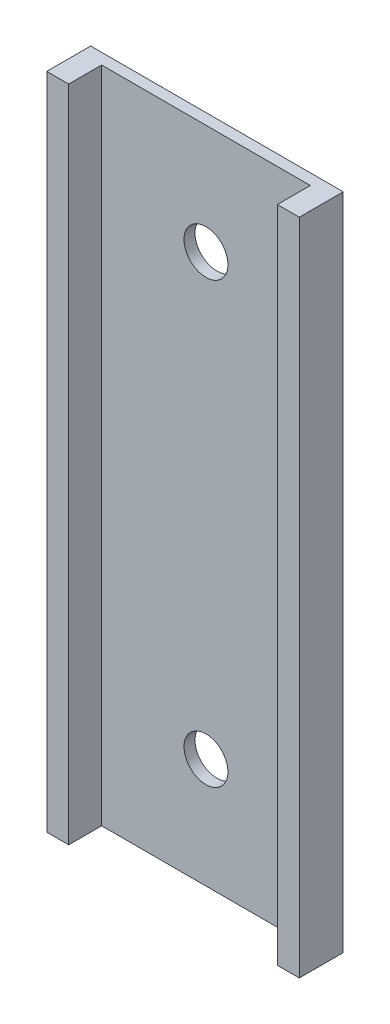
ISO-10303-21;
HEADER;
FILE_DESCRIPTION(('STEP AP214'),'2;1');
FILE_NAME('part.step','',(''),(''),'','','');
FILE_SCHEMA(('AUTOMOTIVE_DESIGN { 1 0 10303 214 1 1 1 1 }'));
ENDSEC;
DATA;
#1=APPLICATION_CONTEXT('core data for automotive mechanical design processes');
#2=APPLICATION_PROTOCOL_DEFINITION('international standard','automotive_design',2000,#1);
#3=PRODUCT_CONTEXT('',#1,'mechanical');
#4=PRODUCT('Part','Part','',(#3));
#5=PRODUCT_RELATED_PRODUCT_CATEGORY('part','',(#4));
#6=PRODUCT_DEFINITION_FORMATION('','',#4);
#7=PRODUCT_DEFINITION_CONTEXT('part definition',#1,'design');
#8=PRODUCT_DEFINITION('design','',#6,#7);
#9=PRODUCT_DEFINITION_SHAPE('','',#8);
#10=(LENGTH_UNIT() NAMED_UNIT(*) SI_UNIT(.MILLI.,.METRE.));
#11=(NAMED_UNIT(*) PLANE_ANGLE_UNIT() SI_UNIT($,.RADIAN.));
#12=(NAMED_UNIT(*) SI_UNIT($,.STERADIAN.) SOLID_ANGLE_UNIT());
#13=UNCERTAINTY_MEASURE_WITH_UNIT(LENGTH_MEASURE(1.E-05),#10,'distance_accuracy_value','');
#14=(GEOMETRIC_REPRESENTATION_CONTEXT(3) GLOBAL_UNCERTAINTY_ASSIGNED_CONTEXT((#13)) GLOBAL_UNIT_ASSIGNED_CONTEXT((#10,
#11,#12)) REPRESENTATION_CONTEXT('',''));
#15=CARTESIAN_POINT('',(0.,0.,0.));
#16=DIRECTION('',(0.,0.,1.));
#17=DIRECTION('',(1.,0.,0.));
#18=AXIS2_PLACEMENT_3D('',#15,#16,#17);
#19=CARTESIAN_POINT('',(0.,0.,4.));
#20=DIRECTION('',(0.,0.,-1.));
#21=DIRECTION('',(-1.,0.,0.));
#22=AXIS2_PLACEMENT_3D('',#19,#20,#21);
#23=PLANE('',#22);
#24=DIRECTION('',(-1.,0.,0.));
#25=VECTOR('',#24,1.);
#26=CARTESIAN_POINT('',(0.051140333410662,-40.0299787172891,4.));
#27=LINE('',#26,#25);
#28=CARTESIAN_POINT('',(23.0511403334107,-40.0299787172891,4.));
#29=VERTEX_POINT('',#28);
#30=CARTESIAN_POINT('',(21.0511403334107,-40.0299787172891,4.));
#31=VERTEX_POINT('',#30);
#32=EDGE_CURVE('E149',#29,#31,#27,.T.);
#33=ORIENTED_EDGE('',*,*,#32,.T.);
#34=DIRECTION('',(0.,-1.,0.));
#35=VECTOR('',#34,1.);
#36=CARTESIAN_POINT('',(21.0511403334107,0.,4.));
#37=LINE('',#36,#35);
#38=CARTESIAN_POINT('',(21.0511403334107,-100.029978717289,4.));
#39=VERTEX_POINT('',#38);
#40=EDGE_CURVE('E11',#31,#39,#37,.T.);
#41=ORIENTED_EDGE('',*,*,#40,.T.);
#42=DIRECTION('',(1.,0.,0.));
#43=VECTOR('',#42,1.);
#44=CARTESIAN_POINT('',(0.051140333410662,-100.029978717289,4.));
#45=LINE('',#44,#43);
#46=CARTESIAN_POINT('',(23.0511403334107,-100.029978717289,4.));
#47=VERTEX_POINT('',#46);
#48=EDGE_CURVE('E130',#39,#47,#45,.T.);
#49=ORIENTED_EDGE('',*,*,#48,.T.);
#50=DIRECTION('',(0.,1.,0.));
#51=VECTOR('',#50,1.);
#52=CARTESIAN_POINT('',(23.0511403334107,-100.029978717289,4.));
#53=LINE('',#52,#51);
#54=EDGE_CURVE('E147',#47,#29,#53,.T.);
#55=ORIENTED_EDGE('',*,*,#54,.T.);
#56=EDGE_LOOP('',(#33,#41,#49,#55));
#57=FACE_BOUND('',#56,.T.);
#58=ADVANCED_FACE('F32',(#57),#23,.F.);
#59=CARTESIAN_POINT('',(0.051140333410662,-100.029978717289,4.));
#60=DIRECTION('',(1.,0.,0.));
#61=DIRECTION('',(0.,0.,-1.));
#62=AXIS2_PLACEMENT_3D('',#59,#60,#61);
#63=PLANE('',#62);
#64=DIRECTION('',(0.,-1.,0.));
#65=VECTOR('',#64,1.);
#66=CARTESIAN_POINT('',(0.051140333410662,-100.029978717289,0.));
#67=LINE('',#66,#65);
#68=CARTESIAN_POINT('',(0.051140333410662,-40.0299787172891,0.));
#69=VERTEX_POINT('',#68);
#70=CARTESIAN_POINT('',(0.051140333410662,-100.029978717289,0.));
#71=VERTEX_POINT('',#70);
#72=EDGE_CURVE('E142',#69,#71,#67,.T.);
#73=ORIENTED_EDGE('',*,*,#72,.T.);
#74=DIRECTION('',(0.,0.,-1.));
#75=VECTOR('',#74,1.);
#76=CARTESIAN_POINT('',(0.051140333410662,-100.029978717289,4.));
#77=LINE('',#76,#75);
#78=CARTESIAN_POINT('',(0.051140333410662,-100.029978717289,4.));
#79=VERTEX_POINT('',#78);
#80=EDGE_CURVE('E166',#79,#71,#77,.T.);
#81=ORIENTED_EDGE('',*,*,#80,.F.);
#82=DIRECTION('',(0.,-1.,0.));
#83=VECTOR('',#82,1.);
#84=CARTESIAN_POINT('',(0.051140333410662,-100.029978717289,4.));
#85=LINE('',#84,#83);
#86=CARTESIAN_POINT('',(0.051140333410662,-40.0299787172891,4.));
#87=VERTEX_POINT('',#86);
#88=EDGE_CURVE('E144',#87,#79,#85,.T.);
#89=ORIENTED_EDGE('',*,*,#88,.F.);
#90=DIRECTION('',(0.,0.,-1.));
#91=VECTOR('',#90,1.);
#92=CARTESIAN_POINT('',(0.051140333410662,-40.0299787172891,4.));
#93=LINE('',#92,#91);
#94=EDGE_CURVE('E152',#87,#69,#93,.T.);
#95=ORIENTED_EDGE('',*,*,#94,.T.);
#96=EDGE_LOOP('',(#73,#81,#89,#95));
#97=FACE_BOUND('',#96,.T.);
#98=ADVANCED_FACE('F34',(#97),#63,.F.);
#99=CARTESIAN_POINT('',(0.051140333410662,-100.029978717289,4.));
#100=DIRECTION('',(0.,1.,0.));
#101=DIRECTION('',(-1.,0.,0.));
#102=AXIS2_PLACEMENT_3D('',#99,#100,#101);
#103=PLANE('',#102);
#104=ORIENTED_EDGE('',*,*,#48,.F.);
#105=DIRECTION('',(0.,0.,-1.));
#106=VECTOR('',#105,1.);
#107=CARTESIAN_POINT('',(21.0511403334107,-100.029978717289,1.));
#108=LINE('',#107,#106);
#109=CARTESIAN_POINT('',(21.0511403334107,-100.029978717289,1.));
#110=VERTEX_POINT('',#109);
#111=EDGE_CURVE('E113',#39,#110,#108,.T.);
#112=ORIENTED_EDGE('',*,*,#111,.T.);
#113=DIRECTION('',(-1.,0.,0.));
#114=VECTOR('',#113,1.);
#115=CARTESIAN_POINT('',(21.0511403334107,-100.029978717289,1.));
#116=LINE('',#115,#114);
#117=CARTESIAN_POINT('',(2.05114033341066,-100.029978717289,1.));
#118=VERTEX_POINT('',#117);
#119=EDGE_CURVE('E123',#110,#118,#116,.T.);
#120=ORIENTED_EDGE('',*,*,#119,.T.);
#121=DIRECTION('',(0.,0.,1.));
#122=VECTOR('',#121,1.);
#123=CARTESIAN_POINT('',(2.05114033341066,-100.029978717289,1.));
#124=LINE('',#123,#122);
#125=CARTESIAN_POINT('',(2.05114033341066,-100.029978717289,4.));
#126=VERTEX_POINT('',#125);
#127=EDGE_CURVE('E120',#118,#126,#124,.T.);
#128=ORIENTED_EDGE('',*,*,#127,.T.);
#129=EDGE_CURVE('E87',#79,#126,#45,.T.);
#130=ORIENTED_EDGE('',*,*,#129,.F.);
#131=ORIENTED_EDGE('',*,*,#80,.T.);
#132=DIRECTION('',(1.,0.,0.));
#133=VECTOR('',#132,1.);
#134=CARTESIAN_POINT('',(0.051140333410662,-100.029978717289,0.));
#135=LINE('',#134,#133);
#136=CARTESIAN_POINT('',(23.0511403334107,-100.029978717289,0.));
#137=VERTEX_POINT('',#136);
#138=EDGE_CURVE('E155',#71,#137,#135,.T.);
#139=ORIENTED_EDGE('',*,*,#138,.T.);
#140=DIRECTION('',(0.,0.,-1.));
#141=VECTOR('',#140,1.);
#142=CARTESIAN_POINT('',(23.0511403334107,-100.029978717289,4.));
#143=LINE('',#142,#141);
#144=EDGE_CURVE('E163',#47,#137,#143,.T.);
#145=ORIENTED_EDGE('',*,*,#144,.F.);
#146=EDGE_LOOP('',(#104,#112,#120,#128,#130,#131,#139,#145));
#147=FACE_BOUND('',#146,.T.);
#148=ADVANCED_FACE('F128',(#147),#103,.F.);
#149=CARTESIAN_POINT('',(23.0511403334107,-100.029978717289,4.));
#150=DIRECTION('',(-1.,0.,0.));
#151=DIRECTION('',(0.,0.,1.));
#152=AXIS2_PLACEMENT_3D('',#149,#150,#151);
#153=PLANE('',#152);
#154=DIRECTION('',(0.,1.,0.));
#155=VECTOR('',#154,1.);
#156=CARTESIAN_POINT('',(23.0511403334107,-100.029978717289,0.));
#157=LINE('',#156,#155);
#158=CARTESIAN_POINT('',(23.0511403334107,-40.0299787172891,0.));
#159=VERTEX_POINT('',#158);
#160=EDGE_CURVE('E157',#137,#159,#157,.T.);
#161=ORIENTED_EDGE('',*,*,#160,.T.);
#162=DIRECTION('',(0.,0.,-1.));
#163=VECTOR('',#162,1.);
#164=CARTESIAN_POINT('',(23.0511403334107,-40.0299787172891,4.));
#165=LINE('',#164,#163);
#166=EDGE_CURVE('E161',#29,#159,#165,.T.);
#167=ORIENTED_EDGE('',*,*,#166,.F.);
#168=ORIENTED_EDGE('',*,*,#54,.F.);
#169=ORIENTED_EDGE('',*,*,#144,.T.);
#170=EDGE_LOOP('',(#161,#167,#168,#169));
#171=FACE_BOUND('',#170,.T.);
#172=ADVANCED_FACE('F201',(#171),#153,.F.);
#173=CARTESIAN_POINT('',(0.051140333410662,-40.0299787172891,4.));
#174=DIRECTION('',(0.,-1.,0.));
#175=DIRECTION('',(0.,0.,-1.));
#176=AXIS2_PLACEMENT_3D('',#173,#174,#175);
#177=PLANE('',#176);
#178=DIRECTION('',(-1.,0.,0.));
#179=VECTOR('',#178,1.);
#180=CARTESIAN_POINT('',(21.0511403334107,-40.0299787172891,1.));
#181=LINE('',#180,#179);
#182=CARTESIAN_POINT('',(21.0511403334107,-40.0299787172891,1.));
#183=VERTEX_POINT('',#182);
#184=CARTESIAN_POINT('',(2.05114033341066,-40.0299787172891,1.));
#185=VERTEX_POINT('',#184);
#186=EDGE_CURVE('E132',#183,#185,#181,.T.);
#187=ORIENTED_EDGE('',*,*,#186,.F.);
#188=DIRECTION('',(0.,0.,-1.));
#189=VECTOR('',#188,1.);
#190=CARTESIAN_POINT('',(21.0511403334107,-40.0299787172891,1.));
#191=LINE('',#190,#189);
#192=EDGE_CURVE('E115',#31,#183,#191,.T.);
#193=ORIENTED_EDGE('',*,*,#192,.F.);
#194=ORIENTED_EDGE('',*,*,#32,.F.);
#195=ORIENTED_EDGE('',*,*,#166,.T.);
#196=DIRECTION('',(-1.,0.,0.));
#197=VECTOR('',#196,1.);
#198=CARTESIAN_POINT('',(0.051140333410662,-40.0299787172891,0.));
#199=LINE('',#198,#197);
#200=EDGE_CURVE('E79',#159,#69,#199,.T.);
#201=ORIENTED_EDGE('',*,*,#200,.T.);
#202=ORIENTED_EDGE('',*,*,#94,.F.);
#203=CARTESIAN_POINT('',(2.05114033341066,-40.0299787172891,4.));
#204=VERTEX_POINT('',#203);
#205=EDGE_CURVE('E57',#204,#87,#27,.T.);
#206=ORIENTED_EDGE('',*,*,#205,.F.);
#207=DIRECTION('',(0.,0.,1.));
#208=VECTOR('',#207,1.);
#209=CARTESIAN_POINT('',(2.05114033341066,-40.0299787172891,1.));
#210=LINE('',#209,#208);
#211=EDGE_CURVE('E49',#185,#204,#210,.T.);
#212=ORIENTED_EDGE('',*,*,#211,.F.);
#213=EDGE_LOOP('',(#187,#193,#194,#195,#201,#202,#206,#212));
#214=FACE_BOUND('',#213,.T.);
#215=ADVANCED_FACE('F195',(#214),#177,.F.);
#216=ORIENTED_EDGE('',*,*,#129,.T.);
#217=DIRECTION('',(0.,1.,0.));
#218=VECTOR('',#217,1.);
#219=CARTESIAN_POINT('',(2.05114033341066,0.,4.));
#220=LINE('',#219,#218);
#221=EDGE_CURVE('E41',#126,#204,#220,.T.);
#222=ORIENTED_EDGE('',*,*,#221,.T.);
#223=ORIENTED_EDGE('',*,*,#205,.T.);
#224=ORIENTED_EDGE('',*,*,#88,.T.);
#225=EDGE_LOOP('',(#216,#222,#223,#224));
#226=FACE_BOUND('',#225,.T.);
#227=ADVANCED_FACE('F187',(#226),#23,.F.);
#228=CARTESIAN_POINT('',(0.,0.,0.));
#229=DIRECTION('',(0.,0.,-1.));
#230=DIRECTION('',(-1.,0.,0.));
#231=AXIS2_PLACEMENT_3D('',#228,#229,#230);
#232=PLANE('',#231);
#233=CARTESIAN_POINT('',(11.5511403334107,-90.0299787172891,0.));
#234=DIRECTION('',(0.,0.,-1.));
#235=DIRECTION('',(-1.,0.,0.));
#236=AXIS2_PLACEMENT_3D('',#233,#234,#235);
#237=CIRCLE('',#236,2.);
#238=CARTESIAN_POINT('',(9.55114033341066,-90.0299787172891,0.));
#239=VERTEX_POINT('',#238);
#240=EDGE_CURVE('E175',#239,#239,#237,.T.);
#241=ORIENTED_EDGE('',*,*,#240,.F.);
#242=EDGE_LOOP('',(#241));
#243=FACE_BOUND('',#242,.T.);
#244=CARTESIAN_POINT('',(11.5511403334107,-50.0299787172891,0.));
#245=DIRECTION('',(0.,0.,-1.));
#246=DIRECTION('',(-1.,0.,0.));
#247=AXIS2_PLACEMENT_3D('',#244,#245,#246);
#248=CIRCLE('',#247,2.);
#249=CARTESIAN_POINT('',(9.55114033341066,-50.0299787172891,0.));
#250=VERTEX_POINT('',#249);
#251=EDGE_CURVE('E135',#250,#250,#248,.T.);
#252=ORIENTED_EDGE('',*,*,#251,.F.);
#253=EDGE_LOOP('',(#252));
#254=FACE_BOUND('',#253,.T.);
#255=ORIENTED_EDGE('',*,*,#72,.F.);
#256=ORIENTED_EDGE('',*,*,#200,.F.);
#257=ORIENTED_EDGE('',*,*,#160,.F.);
#258=ORIENTED_EDGE('',*,*,#138,.F.);
#259=EDGE_LOOP('',(#255,#256,#257,#258));
#260=FACE_BOUND('',#259,.T.);
#261=ADVANCED_FACE('F184',(#243,#254,#260),#232,.T.);
#262=CARTESIAN_POINT('',(21.0511403334107,-100.029978717289,1.));
#263=DIRECTION('',(1.,0.,0.));
#264=DIRECTION('',(0.,0.,-1.));
#265=AXIS2_PLACEMENT_3D('',#262,#263,#264);
#266=PLANE('',#265);
#267=ORIENTED_EDGE('',*,*,#192,.T.);
#268=DIRECTION('',(0.,1.,0.));
#269=VECTOR('',#268,1.);
#270=CARTESIAN_POINT('',(21.0511403334107,-100.029978717289,1.));
#271=LINE('',#270,#269);
#272=EDGE_CURVE('E109',#110,#183,#271,.T.);
#273=ORIENTED_EDGE('',*,*,#272,.F.);
#274=ORIENTED_EDGE('',*,*,#111,.F.);
#275=ORIENTED_EDGE('',*,*,#40,.F.);
#276=EDGE_LOOP('',(#267,#273,#274,#275));
#277=FACE_BOUND('',#276,.T.);
#278=ADVANCED_FACE('F111',(#277),#266,.F.);
#279=CARTESIAN_POINT('',(2.05114033341066,-100.029978717289,1.));
#280=DIRECTION('',(-1.,0.,0.));
#281=DIRECTION('',(0.,0.,1.));
#282=AXIS2_PLACEMENT_3D('',#279,#280,#281);
#283=PLANE('',#282);
#284=ORIENTED_EDGE('',*,*,#127,.F.);
#285=DIRECTION('',(0.,1.,0.));
#286=VECTOR('',#285,1.);
#287=CARTESIAN_POINT('',(2.05114033341066,-100.029978717289,1.));
#288=LINE('',#287,#286);
#289=EDGE_CURVE('E119',#118,#185,#288,.T.);
#290=ORIENTED_EDGE('',*,*,#289,.T.);
#291=ORIENTED_EDGE('',*,*,#211,.T.);
#292=ORIENTED_EDGE('',*,*,#221,.F.);
#293=EDGE_LOOP('',(#284,#290,#291,#292));
#294=FACE_BOUND('',#293,.T.);
#295=ADVANCED_FACE('F218',(#294),#283,.F.);
#296=CARTESIAN_POINT('',(21.0511403334107,-100.029978717289,1.));
#297=DIRECTION('',(0.,0.,-1.));
#298=DIRECTION('',(-1.,0.,0.));
#299=AXIS2_PLACEMENT_3D('',#296,#297,#298);
#300=PLANE('',#299);
#301=CARTESIAN_POINT('',(11.5511403334107,-90.0299787172891,1.));
#302=DIRECTION('',(0.,0.,-1.));
#303=DIRECTION('',(-1.,0.,0.));
#304=AXIS2_PLACEMENT_3D('',#301,#302,#303);
#305=CIRCLE('',#304,2.);
#306=CARTESIAN_POINT('',(9.55114033341066,-90.0299787172891,1.));
#307=VERTEX_POINT('',#306);
#308=EDGE_CURVE('E36',#307,#307,#305,.T.);
#309=ORIENTED_EDGE('',*,*,#308,.T.);
#310=EDGE_LOOP('',(#309));
#311=FACE_BOUND('',#310,.T.);
#312=CARTESIAN_POINT('',(11.5511403334107,-50.0299787172891,1.));
#313=DIRECTION('',(0.,0.,-1.));
#314=DIRECTION('',(-1.,0.,0.));
#315=AXIS2_PLACEMENT_3D('',#312,#313,#314);
#316=CIRCLE('',#315,2.);
#317=CARTESIAN_POINT('',(9.55114033341066,-50.0299787172891,1.));
#318=VERTEX_POINT('',#317);
#319=EDGE_CURVE('E140',#318,#318,#316,.T.);
#320=ORIENTED_EDGE('',*,*,#319,.T.);
#321=EDGE_LOOP('',(#320));
#322=FACE_BOUND('',#321,.T.);
#323=ORIENTED_EDGE('',*,*,#186,.T.);
#324=ORIENTED_EDGE('',*,*,#289,.F.);
#325=ORIENTED_EDGE('',*,*,#119,.F.);
#326=ORIENTED_EDGE('',*,*,#272,.T.);
#327=EDGE_LOOP('',(#323,#324,#325,#326));
#328=FACE_BOUND('',#327,.T.);
#329=ADVANCED_FACE('F124',(#311,#322,#328),#300,.F.);
#330=CARTESIAN_POINT('',(11.5511403334107,-50.0299787172891,4.));
#331=DIRECTION('',(0.,0.,-1.));
#332=DIRECTION('',(-1.,0.,0.));
#333=AXIS2_PLACEMENT_3D('',#330,#331,#332);
#334=CYLINDRICAL_SURFACE('',#333,2.);
#335=ORIENTED_EDGE('',*,*,#251,.T.);
#336=EDGE_LOOP('',(#335));
#337=FACE_BOUND('',#336,.T.);
#338=ORIENTED_EDGE('',*,*,#319,.F.);
#339=EDGE_LOOP('',(#338));
#340=FACE_BOUND('',#339,.T.);
#341=ADVANCED_FACE('F225',(#337,#340),#334,.F.);
#342=CARTESIAN_POINT('',(11.5511403334107,-90.0299787172891,4.));
#343=DIRECTION('',(0.,0.,-1.));
#344=DIRECTION('',(-1.,0.,0.));
#345=AXIS2_PLACEMENT_3D('',#342,#343,#344);
#346=CYLINDRICAL_SURFACE('',#345,2.);
#347=ORIENTED_EDGE('',*,*,#240,.T.);
#348=EDGE_LOOP('',(#347));
#349=FACE_BOUND('',#348,.T.);
#350=ORIENTED_EDGE('',*,*,#308,.F.);
#351=EDGE_LOOP('',(#350));
#352=FACE_BOUND('',#351,.T.);
#353=ADVANCED_FACE('F181',(#349,#352),#346,.F.);
#354=CLOSED_SHELL('',(#58,#98,#148,#172,#215,#227,#261,#278,#295,#329,#341,#353));
#355=MANIFOLD_SOLID_BREP('B2',#354);
#356=ADVANCED_BREP_SHAPE_REPRESENTATION('',(#18,#355),#14);
#357=SHAPE_DEFINITION_REPRESENTATION(#9,#356);
ENDSEC;
END-ISO-10303-21;
